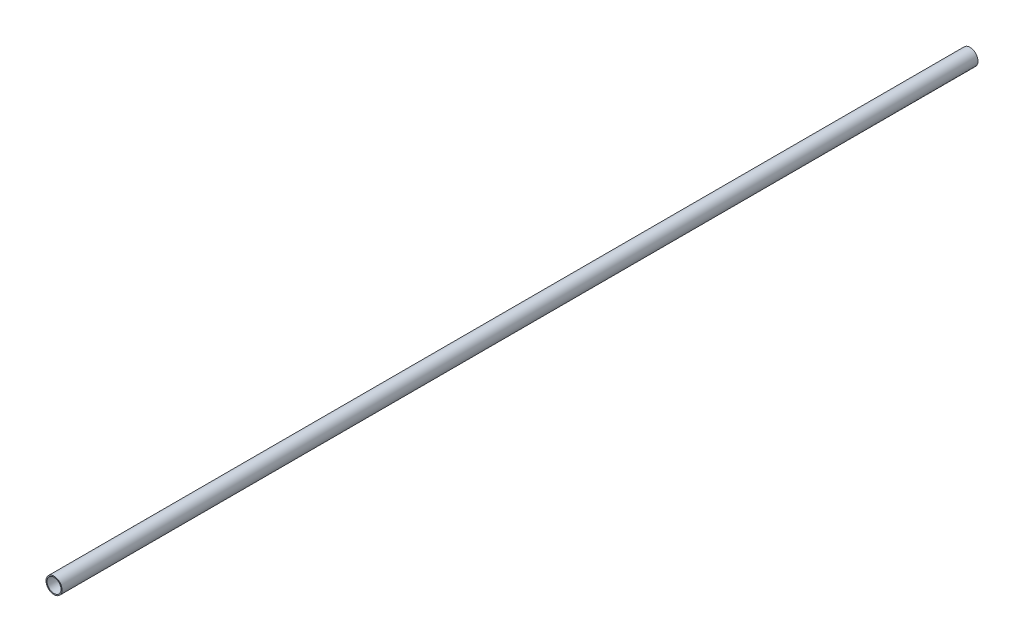
ISO-10303-21;
HEADER;
FILE_DESCRIPTION(('STEP AP214'),'2;1');
FILE_NAME('part.step','',(''),(''),'','','');
FILE_SCHEMA(('AUTOMOTIVE_DESIGN { 1 0 10303 214 1 1 1 1 }'));
ENDSEC;
DATA;
#1=APPLICATION_CONTEXT('core data for automotive mechanical design processes');
#2=APPLICATION_PROTOCOL_DEFINITION('international standard','automotive_design',2000,#1);
#3=PRODUCT_CONTEXT('',#1,'mechanical');
#4=PRODUCT('Part','Part','',(#3));
#5=PRODUCT_RELATED_PRODUCT_CATEGORY('part','',(#4));
#6=PRODUCT_DEFINITION_FORMATION('','',#4);
#7=PRODUCT_DEFINITION_CONTEXT('part definition',#1,'design');
#8=PRODUCT_DEFINITION('design','',#6,#7);
#9=PRODUCT_DEFINITION_SHAPE('','',#8);
#10=(LENGTH_UNIT() NAMED_UNIT(*) SI_UNIT(.MILLI.,.METRE.));
#11=(NAMED_UNIT(*) PLANE_ANGLE_UNIT() SI_UNIT($,.RADIAN.));
#12=(NAMED_UNIT(*) SI_UNIT($,.STERADIAN.) SOLID_ANGLE_UNIT());
#13=UNCERTAINTY_MEASURE_WITH_UNIT(LENGTH_MEASURE(1.E-05),#10,'distance_accuracy_value','');
#14=(GEOMETRIC_REPRESENTATION_CONTEXT(3) GLOBAL_UNCERTAINTY_ASSIGNED_CONTEXT((#13)) GLOBAL_UNIT_ASSIGNED_CONTEXT((#10,
#11,#12)) REPRESENTATION_CONTEXT('',''));
#15=CARTESIAN_POINT('',(0.,0.,0.));
#16=DIRECTION('',(0.,0.,1.));
#17=DIRECTION('',(1.,0.,0.));
#18=AXIS2_PLACEMENT_3D('',#15,#16,#17);
#19=CARTESIAN_POINT('',(2449.7201128805,-5187.00741573402,2750.));
#20=DIRECTION('',(0.,0.,1.));
#21=DIRECTION('',(1.,0.,0.));
#22=AXIS2_PLACEMENT_3D('',#19,#20,#21);
#23=PLANE('',#22);
#24=CARTESIAN_POINT('',(2449.7201128805,-5187.00741573402,2750.));
#25=DIRECTION('',(0.,0.,1.));
#26=DIRECTION('',(1.,0.,0.));
#27=AXIS2_PLACEMENT_3D('',#24,#25,#26);
#28=CIRCLE('',#27,24.125);
#29=CARTESIAN_POINT('',(2473.8451128805,-5187.00741573402,2750.));
#30=VERTEX_POINT('',#29);
#31=EDGE_CURVE('E10',#30,#30,#28,.T.);
#32=ORIENTED_EDGE('',*,*,#31,.T.);
#33=EDGE_LOOP('',(#32));
#34=FACE_BOUND('',#33,.T.);
#35=CARTESIAN_POINT('',(2449.7201128805,-5187.00741573402,2750.));
#36=DIRECTION('',(0.,0.,1.));
#37=DIRECTION('',(1.,0.,0.));
#38=AXIS2_PLACEMENT_3D('',#35,#36,#37);
#39=CIRCLE('',#38,21.0750000000002);
#40=CARTESIAN_POINT('',(2470.7951128805,-5187.00741573402,2750.));
#41=VERTEX_POINT('',#40);
#42=EDGE_CURVE('E43',#41,#41,#39,.T.);
#43=ORIENTED_EDGE('',*,*,#42,.F.);
#44=EDGE_LOOP('',(#43));
#45=FACE_BOUND('',#44,.T.);
#46=ADVANCED_FACE('F32',(#34,#45),#23,.T.);
#47=CARTESIAN_POINT('',(2449.7201128805,-5187.00741573402,0.));
#48=DIRECTION('',(0.,0.,1.));
#49=DIRECTION('',(1.,0.,0.));
#50=AXIS2_PLACEMENT_3D('',#47,#48,#49);
#51=PLANE('',#50);
#52=CARTESIAN_POINT('',(2449.7201128805,-5187.00741573402,0.));
#53=DIRECTION('',(0.,0.,1.));
#54=DIRECTION('',(1.,0.,0.));
#55=AXIS2_PLACEMENT_3D('',#52,#53,#54);
#56=CIRCLE('',#55,24.125);
#57=CARTESIAN_POINT('',(2473.8451128805,-5187.00741573402,0.));
#58=VERTEX_POINT('',#57);
#59=EDGE_CURVE('E36',#58,#58,#56,.T.);
#60=ORIENTED_EDGE('',*,*,#59,.F.);
#61=EDGE_LOOP('',(#60));
#62=FACE_BOUND('',#61,.T.);
#63=CARTESIAN_POINT('',(2449.7201128805,-5187.00741573402,0.));
#64=DIRECTION('',(0.,0.,1.));
#65=DIRECTION('',(1.,0.,0.));
#66=AXIS2_PLACEMENT_3D('',#63,#64,#65);
#67=CIRCLE('',#66,21.0750000000002);
#68=CARTESIAN_POINT('',(2470.7951128805,-5187.00741573402,0.));
#69=VERTEX_POINT('',#68);
#70=EDGE_CURVE('E45',#69,#69,#67,.T.);
#71=ORIENTED_EDGE('',*,*,#70,.T.);
#72=EDGE_LOOP('',(#71));
#73=FACE_BOUND('',#72,.T.);
#74=ADVANCED_FACE('F55',(#62,#73),#51,.F.);
#75=CARTESIAN_POINT('',(2449.7201128805,-5187.00741573402,2750.));
#76=DIRECTION('',(0.,0.,-1.));
#77=DIRECTION('',(-1.,0.,0.));
#78=AXIS2_PLACEMENT_3D('',#75,#76,#77);
#79=CYLINDRICAL_SURFACE('',#78,24.125);
#80=ORIENTED_EDGE('',*,*,#31,.F.);
#81=EDGE_LOOP('',(#80));
#82=FACE_BOUND('',#81,.T.);
#83=ORIENTED_EDGE('',*,*,#59,.T.);
#84=EDGE_LOOP('',(#83));
#85=FACE_BOUND('',#84,.T.);
#86=ADVANCED_FACE('F34',(#82,#85),#79,.T.);
#87=CARTESIAN_POINT('',(2449.7201128805,-5187.00741573402,2750.));
#88=DIRECTION('',(0.,0.,-1.));
#89=DIRECTION('',(-1.,0.,0.));
#90=AXIS2_PLACEMENT_3D('',#87,#88,#89);
#91=CYLINDRICAL_SURFACE('',#90,21.0750000000002);
#92=ORIENTED_EDGE('',*,*,#42,.T.);
#93=EDGE_LOOP('',(#92));
#94=FACE_BOUND('',#93,.T.);
#95=ORIENTED_EDGE('',*,*,#70,.F.);
#96=EDGE_LOOP('',(#95));
#97=FACE_BOUND('',#96,.T.);
#98=ADVANCED_FACE('F51',(#94,#97),#91,.F.);
#99=CLOSED_SHELL('',(#46,#74,#86,#98));
#100=MANIFOLD_SOLID_BREP('B2',#99);
#101=ADVANCED_BREP_SHAPE_REPRESENTATION('',(#18,#100),#14);
#102=SHAPE_DEFINITION_REPRESENTATION(#9,#101);
ENDSEC;
END-ISO-10303-21;
